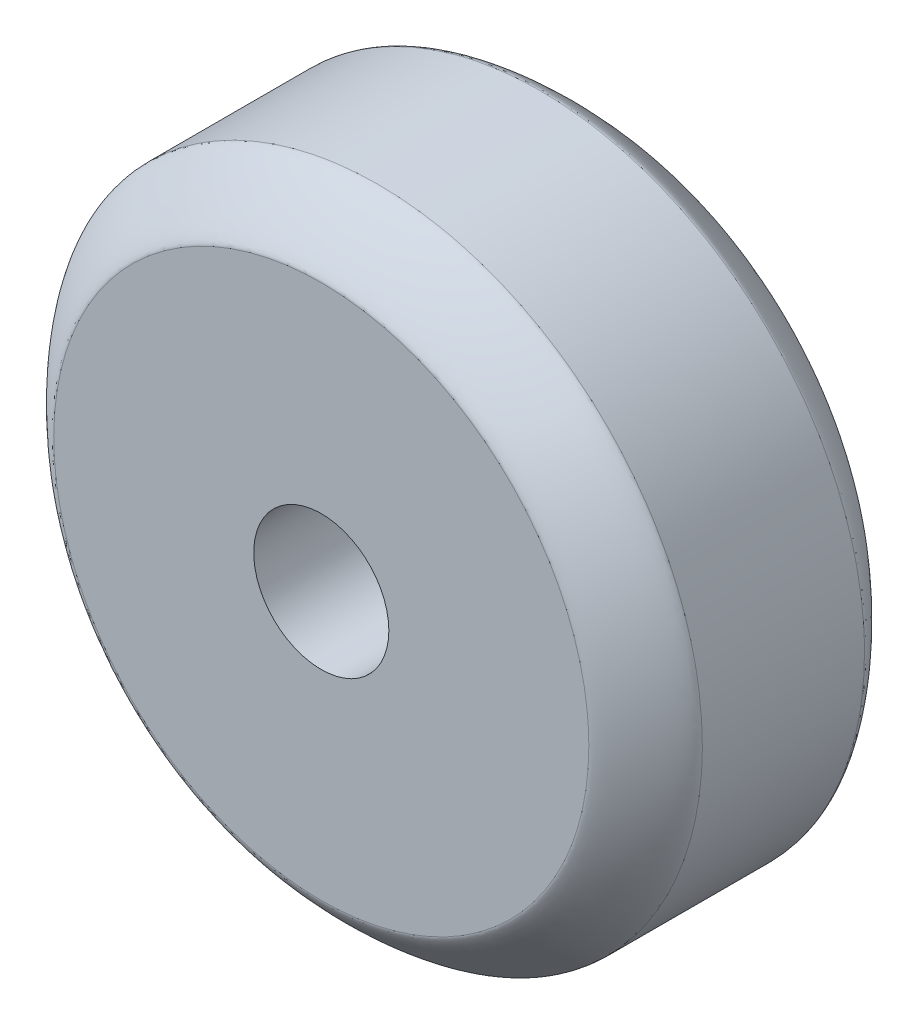
ISO-10303-21;
HEADER;
FILE_DESCRIPTION(('STEP AP214'),'2;1');
FILE_NAME('part.step','',(''),(''),'','','');
FILE_SCHEMA(('AUTOMOTIVE_DESIGN { 1 0 10303 214 1 1 1 1 }'));
ENDSEC;
DATA;
#1=APPLICATION_CONTEXT('core data for automotive mechanical design processes');
#2=APPLICATION_PROTOCOL_DEFINITION('international standard','automotive_design',2000,#1);
#3=PRODUCT_CONTEXT('',#1,'mechanical');
#4=PRODUCT('Part','Part','',(#3));
#5=PRODUCT_RELATED_PRODUCT_CATEGORY('part','',(#4));
#6=PRODUCT_DEFINITION_FORMATION('','',#4);
#7=PRODUCT_DEFINITION_CONTEXT('part definition',#1,'design');
#8=PRODUCT_DEFINITION('design','',#6,#7);
#9=PRODUCT_DEFINITION_SHAPE('','',#8);
#10=(LENGTH_UNIT() NAMED_UNIT(*) SI_UNIT(.MILLI.,.METRE.));
#11=(NAMED_UNIT(*) PLANE_ANGLE_UNIT() SI_UNIT($,.RADIAN.));
#12=(NAMED_UNIT(*) SI_UNIT($,.STERADIAN.) SOLID_ANGLE_UNIT());
#13=UNCERTAINTY_MEASURE_WITH_UNIT(LENGTH_MEASURE(1.E-05),#10,'distance_accuracy_value','');
#14=(GEOMETRIC_REPRESENTATION_CONTEXT(3) GLOBAL_UNCERTAINTY_ASSIGNED_CONTEXT((#13)) GLOBAL_UNIT_ASSIGNED_CONTEXT((#10,
#11,#12)) REPRESENTATION_CONTEXT('',''));
#15=CARTESIAN_POINT('',(0.,0.,0.));
#16=DIRECTION('',(0.,0.,1.));
#17=DIRECTION('',(1.,0.,0.));
#18=AXIS2_PLACEMENT_3D('',#15,#16,#17);
#19=CARTESIAN_POINT('',(0.,0.,10.2));
#20=DIRECTION('',(0.,0.,1.));
#21=DIRECTION('',(1.,0.,0.));
#22=AXIS2_PLACEMENT_3D('',#19,#20,#21);
#23=PLANE('',#22);
#24=CARTESIAN_POINT('',(9.9,0.,10.2));
#25=CARTESIAN_POINT('',(9.9,-1.29590696740118,10.2));
#26=CARTESIAN_POINT('',(9.64232949817243,-2.59130405719254,10.2));
#27=CARTESIAN_POINT('',(8.65048524555104,-4.98582790363627,10.2));
#28=CARTESIAN_POINT('',(7.91670173818388,-6.08401252930976,10.2));
#29=CARTESIAN_POINT('',(6.08401252930972,-7.91670173818392,10.2));
#30=CARTESIAN_POINT('',(4.98582790363568,-8.65048524555105,10.2));
#31=CARTESIAN_POINT('',(2.59130405719307,-9.64232949817244,10.2));
#32=CARTESIAN_POINT('',(1.29590696740211,-9.9,10.2));
#33=CARTESIAN_POINT('',(-1.29590696740208,-9.9,10.2));
#34=CARTESIAN_POINT('',(-2.59130405719254,-9.64232949817243,10.2));
#35=CARTESIAN_POINT('',(-4.98582790363627,-8.65048524555104,10.2));
#36=CARTESIAN_POINT('',(-6.08401252930927,-7.91670173818381,10.2));
#37=CARTESIAN_POINT('',(-7.91670173818437,-6.08401252930984,10.2));
#38=CARTESIAN_POINT('',(-8.65048524554986,-4.98582790363604,10.2));
#39=CARTESIAN_POINT('',(-9.64232949817364,-2.59130405719272,10.2));
#40=CARTESIAN_POINT('',(-9.9,-1.29590696740209,10.2));
#41=CARTESIAN_POINT('',(-9.9,1.29590696740209,10.2));
#42=CARTESIAN_POINT('',(-9.6423294981725,2.59130405719302,10.2));
#43=CARTESIAN_POINT('',(-8.65048524555097,4.98582790363578,10.2));
#44=CARTESIAN_POINT('',(-7.91670173818325,6.08401252930983,10.2));
#45=CARTESIAN_POINT('',(-6.0840125293104,7.9167017381838,10.2));
#46=CARTESIAN_POINT('',(-4.98582790363577,8.65048524555097,10.2));
#47=CARTESIAN_POINT('',(-2.59130405719301,9.6423294981725,10.2));
#48=CARTESIAN_POINT('',(-1.29590696740209,9.9,10.2));
#49=CARTESIAN_POINT('',(1.29590696740209,9.9,10.2));
#50=CARTESIAN_POINT('',(2.59130405719272,9.64232949817251,10.2));
#51=CARTESIAN_POINT('',(4.98582790363605,8.65048524555098,10.2));
#52=CARTESIAN_POINT('',(6.08401252930995,7.91670173818426,10.2));
#53=CARTESIAN_POINT('',(7.91670173818369,6.08401252930939,10.2));
#54=CARTESIAN_POINT('',(8.65048524554958,4.98582790363558,10.2));
#55=CARTESIAN_POINT('',(9.6423294981739,2.59130405719319,10.2));
#56=CARTESIAN_POINT('',(9.9,1.29590696740117,10.2));
#57=CARTESIAN_POINT('',(9.9,0.,10.2));
#58=(BOUNDED_CURVE() B_SPLINE_CURVE(3,(#24,#25,#26,#27,#28,#29,#30,#31,#32,#33,#34,#35,#36,#37,
#38,#39,#40,#41,#42,#43,#44,#45,#46,#47,#48,#49,#50,#51,#52,#53,#54,#55,#56,#57),.UNSPECIFIED.,
.T.,.F.) B_SPLINE_CURVE_WITH_KNOTS((4,2,2,2,2,2,2,2,2,2,2,2,2,2,2,2,4),(0.,0.392699081698725,
0.785398163397448,1.17809724509617,1.5707963267949,1.96349540849362,2.35619449019234,
2.74889357189107,3.14159265358979,3.53429173528852,3.92699081698724,4.31968989868597,
4.71238898038469,5.10508806208341,5.49778714378214,5.89048622548086,6.28318530717959),
.UNSPECIFIED.) CURVE() GEOMETRIC_REPRESENTATION_ITEM() RATIONAL_B_SPLINE_CURVE((1.,1.,1.,1.,1.,
1.,1.,1.,1.,1.,1.,1.,1.,1.,1.,1.,1.,1.,1.,1.,1.,1.,1.,1.,1.,1.,1.,1.,1.,1.,1.,1.,1.,1.)) REPRESENTATION_ITEM(''));
#59=CARTESIAN_POINT('',(9.9,0.,10.2));
#60=VERTEX_POINT('',#59);
#61=EDGE_CURVE('E11',#60,#60,#58,.F.);
#62=ORIENTED_EDGE('',*,*,#61,.T.);
#63=EDGE_LOOP('',(#62));
#64=FACE_BOUND('',#63,.T.);
#65=CARTESIAN_POINT('',(0.,0.,10.2));
#66=DIRECTION('',(0.,0.,1.));
#67=DIRECTION('',(1.,0.,0.));
#68=AXIS2_PLACEMENT_3D('',#65,#66,#67);
#69=CIRCLE('',#68,2.5);
#70=CARTESIAN_POINT('',(2.5,0.,10.2));
#71=VERTEX_POINT('',#70);
#72=EDGE_CURVE('E72',#71,#71,#69,.T.);
#73=ORIENTED_EDGE('',*,*,#72,.F.);
#74=EDGE_LOOP('',(#73));
#75=FACE_BOUND('',#74,.T.);
#76=ADVANCED_FACE('F44',(#64,#75),#23,.T.);
#77=CARTESIAN_POINT('',(0.,0.,0.));
#78=DIRECTION('',(0.,0.,1.));
#79=DIRECTION('',(1.,0.,0.));
#80=AXIS2_PLACEMENT_3D('',#77,#78,#79);
#81=PLANE('',#80);
#82=CARTESIAN_POINT('',(9.9,0.,0.));
#83=CARTESIAN_POINT('',(9.9,1.29590696740117,0.));
#84=CARTESIAN_POINT('',(9.6423294981739,2.59130405719319,0.));
#85=CARTESIAN_POINT('',(8.65048524554958,4.98582790363558,0.));
#86=CARTESIAN_POINT('',(7.91670173818369,6.08401252930939,0.));
#87=CARTESIAN_POINT('',(6.08401252930995,7.91670173818426,0.));
#88=CARTESIAN_POINT('',(4.98582790363605,8.65048524555098,0.));
#89=CARTESIAN_POINT('',(2.59130405719272,9.64232949817251,0.));
#90=CARTESIAN_POINT('',(1.29590696740209,9.9,0.));
#91=CARTESIAN_POINT('',(-1.29590696740209,9.9,0.));
#92=CARTESIAN_POINT('',(-2.59130405719301,9.6423294981725,0.));
#93=CARTESIAN_POINT('',(-4.98582790363577,8.65048524555097,0.));
#94=CARTESIAN_POINT('',(-6.0840125293104,7.9167017381838,0.));
#95=CARTESIAN_POINT('',(-7.91670173818325,6.08401252930983,0.));
#96=CARTESIAN_POINT('',(-8.65048524555097,4.98582790363578,0.));
#97=CARTESIAN_POINT('',(-9.6423294981725,2.59130405719302,0.));
#98=CARTESIAN_POINT('',(-9.9,1.29590696740209,0.));
#99=CARTESIAN_POINT('',(-9.9,-1.29590696740209,0.));
#100=CARTESIAN_POINT('',(-9.64232949817364,-2.59130405719272,0.));
#101=CARTESIAN_POINT('',(-8.65048524554986,-4.98582790363604,0.));
#102=CARTESIAN_POINT('',(-7.91670173818437,-6.08401252930984,0.));
#103=CARTESIAN_POINT('',(-6.08401252930927,-7.91670173818381,0.));
#104=CARTESIAN_POINT('',(-4.98582790363627,-8.65048524555104,0.));
#105=CARTESIAN_POINT('',(-2.59130405719254,-9.64232949817243,0.));
#106=CARTESIAN_POINT('',(-1.29590696740208,-9.9,0.));
#107=CARTESIAN_POINT('',(1.29590696740211,-9.9,0.));
#108=CARTESIAN_POINT('',(2.59130405719307,-9.64232949817244,0.));
#109=CARTESIAN_POINT('',(4.98582790363568,-8.65048524555105,0.));
#110=CARTESIAN_POINT('',(6.08401252930972,-7.91670173818392,0.));
#111=CARTESIAN_POINT('',(7.91670173818388,-6.08401252930976,0.));
#112=CARTESIAN_POINT('',(8.65048524555104,-4.98582790363627,0.));
#113=CARTESIAN_POINT('',(9.64232949817243,-2.59130405719254,0.));
#114=CARTESIAN_POINT('',(9.9,-1.29590696740118,0.));
#115=CARTESIAN_POINT('',(9.9,0.,0.));
#116=(BOUNDED_CURVE() B_SPLINE_CURVE(3,(#82,#83,#84,#85,#86,#87,#88,#89,#90,#91,#92,#93,#94,#95,
#96,#97,#98,#99,#100,#101,#102,#103,#104,#105,#106,#107,#108,#109,#110,#111,#112,#113,#114,
#115),.UNSPECIFIED.,.T.,.F.) B_SPLINE_CURVE_WITH_KNOTS((4,2,2,2,2,2,2,2,2,2,2,2,2,2,2,2,4),(0.,
0.392699081698724,0.785398163397448,1.17809724509617,1.5707963267949,1.96349540849362,
2.35619449019234,2.74889357189107,3.14159265358979,3.53429173528852,3.92699081698724,
4.31968989868597,4.71238898038469,5.10508806208341,5.49778714378214,5.89048622548086,
6.28318530717959),
.UNSPECIFIED.) CURVE() GEOMETRIC_REPRESENTATION_ITEM() RATIONAL_B_SPLINE_CURVE((1.,1.,1.,1.,1.,
1.,1.,1.,1.,1.,1.,1.,1.,1.,1.,1.,1.,1.,1.,1.,1.,1.,1.,1.,1.,1.,1.,1.,1.,1.,1.,1.,1.,1.)) REPRESENTATION_ITEM(''));
#117=CARTESIAN_POINT('',(9.9,0.,0.));
#118=VERTEX_POINT('',#117);
#119=EDGE_CURVE('E57',#118,#118,#116,.F.);
#120=ORIENTED_EDGE('',*,*,#119,.T.);
#121=EDGE_LOOP('',(#120));
#122=FACE_BOUND('',#121,.T.);
#123=CARTESIAN_POINT('',(0.,0.,0.));
#124=DIRECTION('',(0.,0.,1.));
#125=DIRECTION('',(1.,0.,0.));
#126=AXIS2_PLACEMENT_3D('',#123,#124,#125);
#127=CIRCLE('',#126,2.5);
#128=CARTESIAN_POINT('',(2.5,0.,0.));
#129=VERTEX_POINT('',#128);
#130=EDGE_CURVE('E77',#129,#129,#127,.T.);
#131=ORIENTED_EDGE('',*,*,#130,.T.);
#132=EDGE_LOOP('',(#131));
#133=FACE_BOUND('',#132,.T.);
#134=ADVANCED_FACE('F98',(#122,#133),#81,.F.);
#135=CARTESIAN_POINT('',(0.,0.,10.2));
#136=DIRECTION('',(0.,0.,-1.));
#137=DIRECTION('',(-1.,0.,0.));
#138=AXIS2_PLACEMENT_3D('',#135,#136,#137);
#139=CYLINDRICAL_SURFACE('',#138,12.);
#140=CARTESIAN_POINT('',(12.,0.,2.1));
#141=CARTESIAN_POINT('',(12.,-1.57079632412264,2.1));
#142=CARTESIAN_POINT('',(11.6876721189974,-3.14097461477962,2.1));
#143=CARTESIAN_POINT('',(10.4854366612735,-6.04342776198257,2.1));
#144=CARTESIAN_POINT('',(9.59600210688937,-7.37456064158778,2.1));
#145=CARTESIAN_POINT('',(7.37456064158772,-9.59600210688941,2.1));
#146=CARTESIAN_POINT('',(6.04342776198245,-10.4854366612735,2.1));
#147=CARTESIAN_POINT('',(3.14097461477967,-11.6876721189974,2.1));
#148=CARTESIAN_POINT('',(1.57079632412377,-12.,2.1));
#149=CARTESIAN_POINT('',(-1.57079632412373,-12.,2.1));
#150=CARTESIAN_POINT('',(-3.14097461477962,-11.6876721189974,2.1));
#151=CARTESIAN_POINT('',(-6.04342776198257,-10.4854366612735,2.1));
#152=CARTESIAN_POINT('',(-7.37456064158757,-9.59600210688957,2.1));
#153=CARTESIAN_POINT('',(-9.59600210688956,-7.37456064158758,2.1));
#154=CARTESIAN_POINT('',(-10.4854366612731,-6.0434277619835,2.1));
#155=CARTESIAN_POINT('',(-11.6876721189978,-3.14097461477862,2.1));
#156=CARTESIAN_POINT('',(-12.,-1.57079632412375,2.1));
#157=CARTESIAN_POINT('',(-12.,1.57079632412375,2.1));
#158=CARTESIAN_POINT('',(-11.6876721189974,3.14097461477953,2.1));
#159=CARTESIAN_POINT('',(-10.4854366612734,6.04342776198266,2.1));
#160=CARTESIAN_POINT('',(-9.59600210688901,7.37456064158813,2.1));
#161=CARTESIAN_POINT('',(-7.37456064158815,9.596002106889,2.1));
#162=CARTESIAN_POINT('',(-6.04342776198265,10.4854366612734,2.1));
#163=CARTESIAN_POINT('',(-3.14097461477952,11.6876721189974,2.1));
#164=CARTESIAN_POINT('',(-1.57079632412375,12.,2.1));
#165=CARTESIAN_POINT('',(1.57079632412375,12.,2.1));
#166=CARTESIAN_POINT('',(3.14097461477863,11.6876721189978,2.1));
#167=CARTESIAN_POINT('',(6.04342776198351,10.4854366612731,2.1));
#168=CARTESIAN_POINT('',(7.37456064158748,9.59600210688967,2.1));
#169=CARTESIAN_POINT('',(9.59600210688967,7.37456064158748,2.1));
#170=CARTESIAN_POINT('',(10.4854366612733,6.04342776198288,2.1));
#171=CARTESIAN_POINT('',(11.6876721189975,3.14097461477928,2.1));
#172=CARTESIAN_POINT('',(12.,1.57079632412264,2.1));
#173=CARTESIAN_POINT('',(12.,0.,2.1));
#174=(BOUNDED_CURVE() B_SPLINE_CURVE(3,(#140,#141,#142,#143,#144,#145,#146,#147,#148,#149,#150,
#151,#152,#153,#154,#155,#156,#157,#158,#159,#160,#161,#162,#163,#164,#165,#166,#167,#168,#169,
#170,#171,#172,#173),.UNSPECIFIED.,.T.,.F.) B_SPLINE_CURVE_WITH_KNOTS((4,2,2,2,2,2,2,2,2,2,2,2,
2,2,2,2,4),(0.,0.392699081698725,0.785398163397448,1.17809724509617,1.5707963267949,
1.96349540849362,2.35619449019234,2.74889357189107,3.14159265358979,3.53429173528852,
3.92699081698724,4.31968989868597,4.71238898038469,5.10508806208341,5.49778714378214,
5.89048622548086,6.28318530717959),
.UNSPECIFIED.) CURVE() GEOMETRIC_REPRESENTATION_ITEM() RATIONAL_B_SPLINE_CURVE((1.,1.,1.,1.,1.,
1.,1.,1.,1.,1.,1.,1.,1.,1.,1.,1.,1.,1.,1.,1.,1.,1.,1.,1.,1.,1.,1.,1.,1.,1.,1.,1.,1.,1.)) REPRESENTATION_ITEM(''));
#175=CARTESIAN_POINT('',(12.,0.,2.1));
#176=VERTEX_POINT('',#175);
#177=EDGE_CURVE('E62',#176,#176,#174,.F.);
#178=ORIENTED_EDGE('',*,*,#177,.T.);
#179=EDGE_LOOP('',(#178));
#180=FACE_BOUND('',#179,.T.);
#181=CARTESIAN_POINT('',(12.,0.,8.1));
#182=CARTESIAN_POINT('',(12.,1.57079632412264,8.1));
#183=CARTESIAN_POINT('',(11.6876721189975,3.14097461477928,8.1));
#184=CARTESIAN_POINT('',(10.4854366612733,6.04342776198288,8.1));
#185=CARTESIAN_POINT('',(9.59600210688967,7.37456064158748,8.1));
#186=CARTESIAN_POINT('',(7.37456064158748,9.59600210688967,8.1));
#187=CARTESIAN_POINT('',(6.04342776198351,10.4854366612731,8.1));
#188=CARTESIAN_POINT('',(3.14097461477863,11.6876721189978,8.1));
#189=CARTESIAN_POINT('',(1.57079632412375,12.,8.1));
#190=CARTESIAN_POINT('',(-1.57079632412375,12.,8.1));
#191=CARTESIAN_POINT('',(-3.14097461477952,11.6876721189974,8.1));
#192=CARTESIAN_POINT('',(-6.04342776198265,10.4854366612734,8.1));
#193=CARTESIAN_POINT('',(-7.37456064158815,9.596002106889,8.1));
#194=CARTESIAN_POINT('',(-9.59600210688901,7.37456064158813,8.1));
#195=CARTESIAN_POINT('',(-10.4854366612734,6.04342776198266,8.1));
#196=CARTESIAN_POINT('',(-11.6876721189974,3.14097461477953,8.1));
#197=CARTESIAN_POINT('',(-12.,1.57079632412375,8.1));
#198=CARTESIAN_POINT('',(-12.,-1.57079632412375,8.1));
#199=CARTESIAN_POINT('',(-11.6876721189978,-3.14097461477862,8.1));
#200=CARTESIAN_POINT('',(-10.4854366612731,-6.0434277619835,8.1));
#201=CARTESIAN_POINT('',(-9.59600210688956,-7.37456064158758,8.1));
#202=CARTESIAN_POINT('',(-7.37456064158757,-9.59600210688957,8.1));
#203=CARTESIAN_POINT('',(-6.04342776198257,-10.4854366612735,8.1));
#204=CARTESIAN_POINT('',(-3.14097461477962,-11.6876721189974,8.1));
#205=CARTESIAN_POINT('',(-1.57079632412373,-12.,8.1));
#206=CARTESIAN_POINT('',(1.57079632412377,-12.,8.1));
#207=CARTESIAN_POINT('',(3.14097461477967,-11.6876721189974,8.1));
#208=CARTESIAN_POINT('',(6.04342776198245,-10.4854366612735,8.1));
#209=CARTESIAN_POINT('',(7.37456064158772,-9.59600210688941,8.1));
#210=CARTESIAN_POINT('',(9.59600210688937,-7.37456064158778,8.1));
#211=CARTESIAN_POINT('',(10.4854366612735,-6.04342776198257,8.1));
#212=CARTESIAN_POINT('',(11.6876721189974,-3.14097461477962,8.1));
#213=CARTESIAN_POINT('',(12.,-1.57079632412264,8.1));
#214=CARTESIAN_POINT('',(12.,0.,8.1));
#215=(BOUNDED_CURVE() B_SPLINE_CURVE(3,(#181,#182,#183,#184,#185,#186,#187,#188,#189,#190,#191,
#192,#193,#194,#195,#196,#197,#198,#199,#200,#201,#202,#203,#204,#205,#206,#207,#208,#209,#210,
#211,#212,#213,#214),.UNSPECIFIED.,.T.,.F.) B_SPLINE_CURVE_WITH_KNOTS((4,2,2,2,2,2,2,2,2,2,2,2,
2,2,2,2,4),(0.,0.392699081698724,0.785398163397448,1.17809724509617,1.5707963267949,
1.96349540849362,2.35619449019234,2.74889357189107,3.14159265358979,3.53429173528852,
3.92699081698724,4.31968989868597,4.71238898038469,5.10508806208341,5.49778714378214,
5.89048622548086,6.28318530717959),
.UNSPECIFIED.) CURVE() GEOMETRIC_REPRESENTATION_ITEM() RATIONAL_B_SPLINE_CURVE((1.,1.,1.,1.,1.,
1.,1.,1.,1.,1.,1.,1.,1.,1.,1.,1.,1.,1.,1.,1.,1.,1.,1.,1.,1.,1.,1.,1.,1.,1.,1.,1.,1.,1.)) REPRESENTATION_ITEM(''));
#216=CARTESIAN_POINT('',(12.,0.,8.1));
#217=VERTEX_POINT('',#216);
#218=EDGE_CURVE('E67',#217,#217,#215,.F.);
#219=ORIENTED_EDGE('',*,*,#218,.T.);
#220=EDGE_LOOP('',(#219));
#221=FACE_BOUND('',#220,.T.);
#222=ADVANCED_FACE('F88',(#180,#221),#139,.T.);
#223=CARTESIAN_POINT('',(0.,0.,10.2));
#224=DIRECTION('',(0.,0.,-1.));
#225=DIRECTION('',(-1.,0.,0.));
#226=AXIS2_PLACEMENT_3D('',#223,#224,#225);
#227=CYLINDRICAL_SURFACE('',#226,2.5);
#228=ORIENTED_EDGE('',*,*,#72,.T.);
#229=EDGE_LOOP('',(#228));
#230=FACE_BOUND('',#229,.T.);
#231=ORIENTED_EDGE('',*,*,#130,.F.);
#232=EDGE_LOOP('',(#231));
#233=FACE_BOUND('',#232,.T.);
#234=ADVANCED_FACE('F97',(#230,#233),#227,.F.);
#235=CARTESIAN_POINT('',(12.,0.,2.1));
#236=CARTESIAN_POINT('',(12.,1.57079632412264,2.1));
#237=CARTESIAN_POINT('',(11.6876721189975,3.14097461477928,2.1));
#238=CARTESIAN_POINT('',(10.4854366612733,6.04342776198288,2.1));
#239=CARTESIAN_POINT('',(9.59600210688967,7.37456064158748,2.1));
#240=CARTESIAN_POINT('',(7.37456064158748,9.59600210688967,2.1));
#241=CARTESIAN_POINT('',(6.04342776198351,10.4854366612731,2.1));
#242=CARTESIAN_POINT('',(3.14097461477863,11.6876721189978,2.1));
#243=CARTESIAN_POINT('',(1.57079632412375,12.,2.1));
#244=CARTESIAN_POINT('',(-1.57079632412375,12.,2.1));
#245=CARTESIAN_POINT('',(-3.14097461477952,11.6876721189974,2.1));
#246=CARTESIAN_POINT('',(-6.04342776198265,10.4854366612734,2.1));
#247=CARTESIAN_POINT('',(-7.37456064158815,9.596002106889,2.1));
#248=CARTESIAN_POINT('',(-9.59600210688901,7.37456064158813,2.1));
#249=CARTESIAN_POINT('',(-10.4854366612734,6.04342776198266,2.1));
#250=CARTESIAN_POINT('',(-11.6876721189974,3.14097461477953,2.1));
#251=CARTESIAN_POINT('',(-12.,1.57079632412375,2.1));
#252=CARTESIAN_POINT('',(-12.,-1.57079632412375,2.1));
#253=CARTESIAN_POINT('',(-11.6876721189978,-3.14097461477862,2.1));
#254=CARTESIAN_POINT('',(-10.4854366612731,-6.0434277619835,2.1));
#255=CARTESIAN_POINT('',(-9.59600210688956,-7.37456064158758,2.1));
#256=CARTESIAN_POINT('',(-7.37456064158757,-9.59600210688957,2.1));
#257=CARTESIAN_POINT('',(-6.04342776198257,-10.4854366612735,2.1));
#258=CARTESIAN_POINT('',(-3.14097461477962,-11.6876721189974,2.1));
#259=CARTESIAN_POINT('',(-1.57079632412373,-12.,2.1));
#260=CARTESIAN_POINT('',(1.57079632412377,-12.,2.1));
#261=CARTESIAN_POINT('',(3.14097461477967,-11.6876721189974,2.1));
#262=CARTESIAN_POINT('',(6.04342776198245,-10.4854366612735,2.1));
#263=CARTESIAN_POINT('',(7.37456064158772,-9.59600210688941,2.1));
#264=CARTESIAN_POINT('',(9.59600210688937,-7.37456064158778,2.1));
#265=CARTESIAN_POINT('',(10.4854366612735,-6.04342776198257,2.1));
#266=CARTESIAN_POINT('',(11.6876721189974,-3.14097461477962,2.1));
#267=CARTESIAN_POINT('',(12.,-1.57079632412264,2.1));
#268=CARTESIAN_POINT('',(12.,0.,2.1));
#269=CARTESIAN_POINT('',(12.,0.,0.));
#270=CARTESIAN_POINT('',(12.,1.57079632412264,0.));
#271=CARTESIAN_POINT('',(11.6876721189982,3.14097461477956,0.));
#272=CARTESIAN_POINT('',(10.4854366612727,6.0434277619826,0.));
#273=CARTESIAN_POINT('',(9.59600210689079,7.37456064158748,2.81438711226288E-13));
#274=CARTESIAN_POINT('',(7.37456064158635,9.59600210688967,-2.80571349488299E-13));
#275=CARTESIAN_POINT('',(6.04342776198348,10.485436661273,0.));
#276=CARTESIAN_POINT('',(3.14097461477867,11.6876721189979,0.));
#277=CARTESIAN_POINT('',(1.57079632412375,12.,0.));
#278=CARTESIAN_POINT('',(-1.57079632412375,12.,0.));
#279=CARTESIAN_POINT('',(-3.14097461477924,11.6876721189968,0.));
#280=CARTESIAN_POINT('',(-6.04342776198293,10.4854366612741,0.));
#281=CARTESIAN_POINT('',(-7.37456064158758,9.59600210688956,2.80137668618996E-13));
#282=CARTESIAN_POINT('',(-9.59600210688958,7.37456064158757,-2.81872392094973E-13));
#283=CARTESIAN_POINT('',(-10.4854366612741,6.04342776198294,0.));
#284=CARTESIAN_POINT('',(-11.6876721189968,3.14097461477925,0.));
#285=CARTESIAN_POINT('',(-12.,1.57079632412375,0.));
#286=CARTESIAN_POINT('',(-12.,-1.57079632412375,0.));
#287=CARTESIAN_POINT('',(-11.6876721189979,-3.14097461477866,0.));
#288=CARTESIAN_POINT('',(-10.485436661273,-6.04342776198347,0.));
#289=CARTESIAN_POINT('',(-9.59600210688956,-7.37456064158646,1.12315275968995E-12));
#290=CARTESIAN_POINT('',(-7.37456064158757,-9.5960021068907,-1.12488748316592E-12));
#291=CARTESIAN_POINT('',(-6.04342776198313,-10.4854366612748,0.));
#292=CARTESIAN_POINT('',(-3.14097461477905,-11.687672118996,0.));
#293=CARTESIAN_POINT('',(-1.57079632412373,-12.,0.));
#294=CARTESIAN_POINT('',(1.57079632412377,-12.,0.));
#295=CARTESIAN_POINT('',(3.14097461477958,-11.6876721189972,0.));
#296=CARTESIAN_POINT('',(6.04342776198254,-10.4854366612737,0.));
#297=CARTESIAN_POINT('',(7.37456064158716,-9.59600210688886,0.));
#298=CARTESIAN_POINT('',(9.59600210688993,-7.37456064158834,0.));
#299=CARTESIAN_POINT('',(10.4854366612748,-6.04342776198313,0.));
#300=CARTESIAN_POINT('',(11.687672118996,-3.14097461477905,0.));
#301=CARTESIAN_POINT('',(12.,-1.57079632412264,0.));
#302=CARTESIAN_POINT('',(12.,0.,0.));
#303=CARTESIAN_POINT('',(9.9,0.,0.));
#304=CARTESIAN_POINT('',(9.9,1.29590696740117,0.));
#305=CARTESIAN_POINT('',(9.6423294981739,2.59130405719319,0.));
#306=CARTESIAN_POINT('',(8.65048524554958,4.98582790363558,0.));
#307=CARTESIAN_POINT('',(7.91670173818369,6.08401252930939,0.));
#308=CARTESIAN_POINT('',(6.08401252930995,7.91670173818426,0.));
#309=CARTESIAN_POINT('',(4.98582790363605,8.65048524555098,0.));
#310=CARTESIAN_POINT('',(2.59130405719272,9.64232949817251,0.));
#311=CARTESIAN_POINT('',(1.29590696740209,9.9,0.));
#312=CARTESIAN_POINT('',(-1.29590696740209,9.9,0.));
#313=CARTESIAN_POINT('',(-2.59130405719301,9.6423294981725,0.));
#314=CARTESIAN_POINT('',(-4.98582790363577,8.65048524555097,0.));
#315=CARTESIAN_POINT('',(-6.0840125293104,7.9167017381838,0.));
#316=CARTESIAN_POINT('',(-7.91670173818325,6.08401252930983,0.));
#317=CARTESIAN_POINT('',(-8.65048524555097,4.98582790363578,0.));
#318=CARTESIAN_POINT('',(-9.6423294981725,2.59130405719302,0.));
#319=CARTESIAN_POINT('',(-9.9,1.29590696740209,0.));
#320=CARTESIAN_POINT('',(-9.9,-1.29590696740209,0.));
#321=CARTESIAN_POINT('',(-9.64232949817364,-2.59130405719272,0.));
#322=CARTESIAN_POINT('',(-8.65048524554986,-4.98582790363604,0.));
#323=CARTESIAN_POINT('',(-7.91670173818437,-6.08401252930984,0.));
#324=CARTESIAN_POINT('',(-6.08401252930927,-7.91670173818381,0.));
#325=CARTESIAN_POINT('',(-4.98582790363627,-8.65048524555104,0.));
#326=CARTESIAN_POINT('',(-2.59130405719254,-9.64232949817243,0.));
#327=CARTESIAN_POINT('',(-1.29590696740208,-9.9,0.));
#328=CARTESIAN_POINT('',(1.29590696740211,-9.9,0.));
#329=CARTESIAN_POINT('',(2.59130405719307,-9.64232949817244,0.));
#330=CARTESIAN_POINT('',(4.98582790363568,-8.65048524555105,0.));
#331=CARTESIAN_POINT('',(6.08401252930972,-7.91670173818392,0.));
#332=CARTESIAN_POINT('',(7.91670173818388,-6.08401252930976,0.));
#333=CARTESIAN_POINT('',(8.65048524555104,-4.98582790363627,0.));
#334=CARTESIAN_POINT('',(9.64232949817243,-2.59130405719254,0.));
#335=CARTESIAN_POINT('',(9.9,-1.29590696740118,0.));
#336=CARTESIAN_POINT('',(9.9,0.,0.));
#337=(BOUNDED_SURFACE() B_SPLINE_SURFACE(2,3,((#235,#236,#237,#238,#239,#240,#241,#242,#243,
#244,#245,#246,#247,#248,#249,#250,#251,#252,#253,#254,#255,#256,#257,#258,#259,#260,#261,#262,
#263,#264,#265,#266,#267,#268),(#269,#270,#271,#272,#273,#274,#275,#276,#277,#278,#279,#280,
#281,#282,#283,#284,#285,#286,#287,#288,#289,#290,#291,#292,#293,#294,#295,#296,#297,#298,#299,
#300,#301,#302),(#303,#304,#305,#306,#307,#308,#309,#310,#311,#312,#313,#314,#315,#316,#317,
#318,#319,#320,#321,#322,#323,#324,#325,#326,#327,#328,#329,#330,#331,#332,#333,#334,#335,
#336)),.UNSPECIFIED.,.F.,.T.,.F.) B_SPLINE_SURFACE_WITH_KNOTS((3,3),(4,2,2,2,2,2,2,2,2,2,2,2,2,
2,2,2,4),(0.,1.),(0.,0.392699081698724,0.785398163397448,1.17809724509617,1.5707963267949,
1.96349540849362,2.35619449019234,2.74889357189107,3.14159265358979,3.53429173528852,
3.92699081698724,4.31968989868597,4.71238898038469,5.10508806208341,5.49778714378214,
5.89048622548086,6.28318530717959),
.UNSPECIFIED.) GEOMETRIC_REPRESENTATION_ITEM() RATIONAL_B_SPLINE_SURFACE(((1.,1.,1.,1.,1.,1.,1.,
1.,1.,1.,1.,1.,1.,1.,1.,1.,1.,1.,1.,1.,1.,1.,1.,1.,1.,1.,1.,1.,1.,1.,1.,1.,1.,1.),
(0.148492424049175,0.148492424049175,0.148492424049175,0.148492424049175,0.148492424049175,
0.148492424049175,0.148492424049175,0.148492424049175,0.148492424049175,0.148492424049175,
0.148492424049175,0.148492424049175,0.148492424049175,0.148492424049175,0.148492424049175,
0.148492424049175,0.148492424049175,0.148492424049175,0.148492424049175,0.148492424049175,
0.148492424049175,0.148492424049175,0.148492424049175,0.148492424049175,0.148492424049175,
0.148492424049175,0.148492424049175,0.148492424049175,0.148492424049175,0.148492424049175,
0.148492424049175,0.148492424049175,0.148492424049175,0.148492424049175),(1.,1.,1.,1.,1.,1.,1.,
1.,1.,1.,1.,1.,1.,1.,1.,1.,1.,1.,1.,1.,1.,1.,1.,1.,1.,1.,1.,1.,1.,1.,1.,1.,1.,1.))) REPRESENTATION_ITEM('') SURFACE());
#338=ORIENTED_EDGE('',*,*,#119,.F.);
#339=EDGE_LOOP('',(#338));
#340=FACE_BOUND('',#339,.T.);
#341=ORIENTED_EDGE('',*,*,#177,.F.);
#342=EDGE_LOOP('',(#341));
#343=FACE_BOUND('',#342,.T.);
#344=ADVANCED_FACE('F102',(#340,#343),#337,.T.);
#345=CARTESIAN_POINT('',(9.9,0.,10.2));
#346=CARTESIAN_POINT('',(9.9,1.29590696740117,10.2));
#347=CARTESIAN_POINT('',(9.6423294981739,2.59130405719319,10.2));
#348=CARTESIAN_POINT('',(8.65048524554958,4.98582790363558,10.2));
#349=CARTESIAN_POINT('',(7.91670173818369,6.08401252930939,10.2));
#350=CARTESIAN_POINT('',(6.08401252930995,7.91670173818426,10.2));
#351=CARTESIAN_POINT('',(4.98582790363605,8.65048524555098,10.2));
#352=CARTESIAN_POINT('',(2.59130405719272,9.64232949817251,10.2));
#353=CARTESIAN_POINT('',(1.29590696740209,9.9,10.2));
#354=CARTESIAN_POINT('',(-1.29590696740209,9.9,10.2));
#355=CARTESIAN_POINT('',(-2.59130405719301,9.6423294981725,10.2));
#356=CARTESIAN_POINT('',(-4.98582790363577,8.65048524555097,10.2));
#357=CARTESIAN_POINT('',(-6.0840125293104,7.9167017381838,10.2));
#358=CARTESIAN_POINT('',(-7.91670173818325,6.08401252930983,10.2));
#359=CARTESIAN_POINT('',(-8.65048524555097,4.98582790363578,10.2));
#360=CARTESIAN_POINT('',(-9.6423294981725,2.59130405719302,10.2));
#361=CARTESIAN_POINT('',(-9.9,1.29590696740209,10.2));
#362=CARTESIAN_POINT('',(-9.9,-1.29590696740209,10.2));
#363=CARTESIAN_POINT('',(-9.64232949817364,-2.59130405719272,10.2));
#364=CARTESIAN_POINT('',(-8.65048524554986,-4.98582790363604,10.2));
#365=CARTESIAN_POINT('',(-7.91670173818437,-6.08401252930984,10.2));
#366=CARTESIAN_POINT('',(-6.08401252930927,-7.91670173818381,10.2));
#367=CARTESIAN_POINT('',(-4.98582790363627,-8.65048524555104,10.2));
#368=CARTESIAN_POINT('',(-2.59130405719254,-9.64232949817243,10.2));
#369=CARTESIAN_POINT('',(-1.29590696740208,-9.9,10.2));
#370=CARTESIAN_POINT('',(1.29590696740211,-9.9,10.2));
#371=CARTESIAN_POINT('',(2.59130405719307,-9.64232949817244,10.2));
#372=CARTESIAN_POINT('',(4.98582790363568,-8.65048524555105,10.2));
#373=CARTESIAN_POINT('',(6.08401252930972,-7.91670173818392,10.2));
#374=CARTESIAN_POINT('',(7.91670173818388,-6.08401252930976,10.2));
#375=CARTESIAN_POINT('',(8.65048524555104,-4.98582790363627,10.2));
#376=CARTESIAN_POINT('',(9.64232949817243,-2.59130405719254,10.2));
#377=CARTESIAN_POINT('',(9.9,-1.29590696740118,10.2));
#378=CARTESIAN_POINT('',(9.9,0.,10.2));
#379=CARTESIAN_POINT('',(12.,0.,10.2));
#380=CARTESIAN_POINT('',(12.,1.57079632412264,10.2));
#381=CARTESIAN_POINT('',(11.6876721189982,3.140974614779,10.2));
#382=CARTESIAN_POINT('',(10.4854366612727,6.04342776198316,10.2));
#383=CARTESIAN_POINT('',(9.59600210688967,7.37456064158748,10.2));
#384=CARTESIAN_POINT('',(7.37456064158748,9.59600210688967,10.2));
#385=CARTESIAN_POINT('',(6.04342776198348,10.485436661273,10.2));
#386=CARTESIAN_POINT('',(3.14097461477867,11.6876721189979,10.2));
#387=CARTESIAN_POINT('',(1.57079632412375,12.,10.2));
#388=CARTESIAN_POINT('',(-1.57079632412375,12.,10.2));
#389=CARTESIAN_POINT('',(-3.14097461477924,11.6876721189968,10.2));
#390=CARTESIAN_POINT('',(-6.04342776198293,10.4854366612741,10.2));
#391=CARTESIAN_POINT('',(-7.37456064158758,9.59600210688844,10.2));
#392=CARTESIAN_POINT('',(-9.59600210688958,7.37456064158869,10.2));
#393=CARTESIAN_POINT('',(-10.4854366612741,6.0434277619835,10.2));
#394=CARTESIAN_POINT('',(-11.6876721189968,3.14097461477869,10.2));
#395=CARTESIAN_POINT('',(-12.,1.57079632412375,10.2));
#396=CARTESIAN_POINT('',(-12.,-1.57079632412375,10.2));
#397=CARTESIAN_POINT('',(-11.6876721189979,-3.14097461477866,10.2));
#398=CARTESIAN_POINT('',(-10.485436661273,-6.04342776198347,10.2));
#399=CARTESIAN_POINT('',(-9.59600210688956,-7.37456064158758,10.1999999999989));
#400=CARTESIAN_POINT('',(-7.37456064158757,-9.59600210688957,10.2000000000011));
#401=CARTESIAN_POINT('',(-6.0434277619837,-10.4854366612748,10.2));
#402=CARTESIAN_POINT('',(-3.14097461477849,-11.687672118996,10.2));
#403=CARTESIAN_POINT('',(-1.57079632412373,-12.,10.2));
#404=CARTESIAN_POINT('',(1.57079632412377,-12.,10.2));
#405=CARTESIAN_POINT('',(3.14097461477958,-11.6876721189972,10.2));
#406=CARTESIAN_POINT('',(6.04342776198254,-10.4854366612737,10.2));
#407=CARTESIAN_POINT('',(7.37456064158716,-9.59600210688886,10.2));
#408=CARTESIAN_POINT('',(9.59600210688993,-7.37456064158834,10.2));
#409=CARTESIAN_POINT('',(10.4854366612748,-6.04342776198313,10.2));
#410=CARTESIAN_POINT('',(11.687672118996,-3.14097461477905,10.2));
#411=CARTESIAN_POINT('',(12.,-1.57079632412264,10.2));
#412=CARTESIAN_POINT('',(12.,0.,10.2));
#413=CARTESIAN_POINT('',(12.,0.,8.1));
#414=CARTESIAN_POINT('',(12.,1.57079632412264,8.1));
#415=CARTESIAN_POINT('',(11.6876721189975,3.14097461477928,8.1));
#416=CARTESIAN_POINT('',(10.4854366612733,6.04342776198288,8.1));
#417=CARTESIAN_POINT('',(9.59600210688967,7.37456064158748,8.1));
#418=CARTESIAN_POINT('',(7.37456064158748,9.59600210688967,8.1));
#419=CARTESIAN_POINT('',(6.04342776198351,10.4854366612731,8.1));
#420=CARTESIAN_POINT('',(3.14097461477863,11.6876721189978,8.1));
#421=CARTESIAN_POINT('',(1.57079632412375,12.,8.1));
#422=CARTESIAN_POINT('',(-1.57079632412375,12.,8.1));
#423=CARTESIAN_POINT('',(-3.14097461477952,11.6876721189974,8.1));
#424=CARTESIAN_POINT('',(-6.04342776198265,10.4854366612734,8.1));
#425=CARTESIAN_POINT('',(-7.37456064158815,9.596002106889,8.1));
#426=CARTESIAN_POINT('',(-9.59600210688901,7.37456064158813,8.1));
#427=CARTESIAN_POINT('',(-10.4854366612734,6.04342776198266,8.1));
#428=CARTESIAN_POINT('',(-11.6876721189974,3.14097461477953,8.1));
#429=CARTESIAN_POINT('',(-12.,1.57079632412375,8.1));
#430=CARTESIAN_POINT('',(-12.,-1.57079632412375,8.1));
#431=CARTESIAN_POINT('',(-11.6876721189978,-3.14097461477862,8.1));
#432=CARTESIAN_POINT('',(-10.4854366612731,-6.0434277619835,8.1));
#433=CARTESIAN_POINT('',(-9.59600210688956,-7.37456064158758,8.1));
#434=CARTESIAN_POINT('',(-7.37456064158757,-9.59600210688957,8.1));
#435=CARTESIAN_POINT('',(-6.04342776198257,-10.4854366612735,8.1));
#436=CARTESIAN_POINT('',(-3.14097461477962,-11.6876721189974,8.1));
#437=CARTESIAN_POINT('',(-1.57079632412373,-12.,8.1));
#438=CARTESIAN_POINT('',(1.57079632412377,-12.,8.1));
#439=CARTESIAN_POINT('',(3.14097461477967,-11.6876721189974,8.1));
#440=CARTESIAN_POINT('',(6.04342776198245,-10.4854366612735,8.1));
#441=CARTESIAN_POINT('',(7.37456064158772,-9.59600210688941,8.1));
#442=CARTESIAN_POINT('',(9.59600210688937,-7.37456064158778,8.1));
#443=CARTESIAN_POINT('',(10.4854366612735,-6.04342776198257,8.1));
#444=CARTESIAN_POINT('',(11.6876721189974,-3.14097461477962,8.1));
#445=CARTESIAN_POINT('',(12.,-1.57079632412264,8.1));
#446=CARTESIAN_POINT('',(12.,0.,8.1));
#447=(BOUNDED_SURFACE() B_SPLINE_SURFACE(2,3,((#345,#346,#347,#348,#349,#350,#351,#352,#353,
#354,#355,#356,#357,#358,#359,#360,#361,#362,#363,#364,#365,#366,#367,#368,#369,#370,#371,#372,
#373,#374,#375,#376,#377,#378),(#379,#380,#381,#382,#383,#384,#385,#386,#387,#388,#389,#390,
#391,#392,#393,#394,#395,#396,#397,#398,#399,#400,#401,#402,#403,#404,#405,#406,#407,#408,#409,
#410,#411,#412),(#413,#414,#415,#416,#417,#418,#419,#420,#421,#422,#423,#424,#425,#426,#427,
#428,#429,#430,#431,#432,#433,#434,#435,#436,#437,#438,#439,#440,#441,#442,#443,#444,#445,
#446)),.UNSPECIFIED.,.F.,.T.,.F.) B_SPLINE_SURFACE_WITH_KNOTS((3,3),(4,2,2,2,2,2,2,2,2,2,2,2,2,
2,2,2,4),(0.,1.),(0.,0.392699081698724,0.785398163397448,1.17809724509617,1.5707963267949,
1.96349540849362,2.35619449019234,2.74889357189107,3.14159265358979,3.53429173528852,
3.92699081698724,4.31968989868597,4.71238898038469,5.10508806208341,5.49778714378214,
5.89048622548086,6.28318530717959),
.UNSPECIFIED.) GEOMETRIC_REPRESENTATION_ITEM() RATIONAL_B_SPLINE_SURFACE(((1.,1.,1.,1.,1.,1.,1.,
1.,1.,1.,1.,1.,1.,1.,1.,1.,1.,1.,1.,1.,1.,1.,1.,1.,1.,1.,1.,1.,1.,1.,1.,1.,1.,1.),
(0.148492424049175,0.148492424049175,0.148492424049175,0.148492424049175,0.148492424049175,
0.148492424049175,0.148492424049175,0.148492424049175,0.148492424049175,0.148492424049175,
0.148492424049175,0.148492424049175,0.148492424049175,0.148492424049175,0.148492424049175,
0.148492424049175,0.148492424049175,0.148492424049175,0.148492424049175,0.148492424049175,
0.148492424049175,0.148492424049175,0.148492424049175,0.148492424049175,0.148492424049175,
0.148492424049175,0.148492424049175,0.148492424049175,0.148492424049175,0.148492424049175,
0.148492424049175,0.148492424049175,0.148492424049175,0.148492424049175),(1.,1.,1.,1.,1.,1.,1.,
1.,1.,1.,1.,1.,1.,1.,1.,1.,1.,1.,1.,1.,1.,1.,1.,1.,1.,1.,1.,1.,1.,1.,1.,1.,1.,1.))) REPRESENTATION_ITEM('') SURFACE());
#448=ORIENTED_EDGE('',*,*,#218,.F.);
#449=EDGE_LOOP('',(#448));
#450=FACE_BOUND('',#449,.T.);
#451=ORIENTED_EDGE('',*,*,#61,.F.);
#452=EDGE_LOOP('',(#451));
#453=FACE_BOUND('',#452,.T.);
#454=ADVANCED_FACE('F47',(#450,#453),#447,.T.);
#455=CLOSED_SHELL('',(#76,#134,#222,#234,#344,#454));
#456=MANIFOLD_SOLID_BREP('B2',#455);
#457=ADVANCED_BREP_SHAPE_REPRESENTATION('',(#18,#456),#14);
#458=SHAPE_DEFINITION_REPRESENTATION(#9,#457);
ENDSEC;
END-ISO-10303-21;
